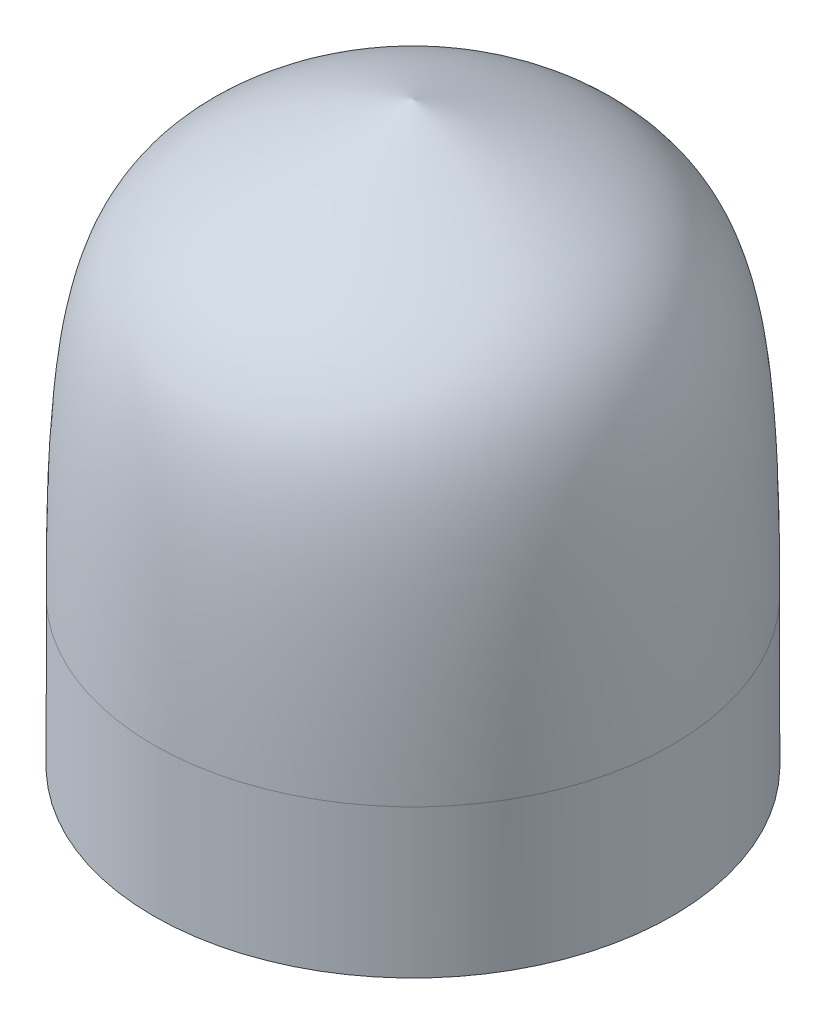
ISO-10303-21;
HEADER;
FILE_DESCRIPTION(('STEP AP214'),'2;1');
FILE_NAME('part.step','',(''),(''),'','','');
FILE_SCHEMA(('AUTOMOTIVE_DESIGN { 1 0 10303 214 1 1 1 1 }'));
ENDSEC;
DATA;
#1=APPLICATION_CONTEXT('core data for automotive mechanical design processes');
#2=APPLICATION_PROTOCOL_DEFINITION('international standard','automotive_design',2000,#1);
#3=PRODUCT_CONTEXT('',#1,'mechanical');
#4=PRODUCT('Part','Part','',(#3));
#5=PRODUCT_RELATED_PRODUCT_CATEGORY('part','',(#4));
#6=PRODUCT_DEFINITION_FORMATION('','',#4);
#7=PRODUCT_DEFINITION_CONTEXT('part definition',#1,'design');
#8=PRODUCT_DEFINITION('design','',#6,#7);
#9=PRODUCT_DEFINITION_SHAPE('','',#8);
#10=(LENGTH_UNIT() NAMED_UNIT(*) SI_UNIT(.MILLI.,.METRE.));
#11=(NAMED_UNIT(*) PLANE_ANGLE_UNIT() SI_UNIT($,.RADIAN.));
#12=(NAMED_UNIT(*) SI_UNIT($,.STERADIAN.) SOLID_ANGLE_UNIT());
#13=UNCERTAINTY_MEASURE_WITH_UNIT(LENGTH_MEASURE(1.E-05),#10,'distance_accuracy_value','');
#14=(GEOMETRIC_REPRESENTATION_CONTEXT(3) GLOBAL_UNCERTAINTY_ASSIGNED_CONTEXT((#13)) GLOBAL_UNIT_ASSIGNED_CONTEXT((#10,
#11,#12)) REPRESENTATION_CONTEXT('',''));
#15=CARTESIAN_POINT('',(0.,0.,0.));
#16=DIRECTION('',(0.,0.,1.));
#17=DIRECTION('',(1.,0.,0.));
#18=AXIS2_PLACEMENT_3D('',#15,#16,#17);
#19=CARTESIAN_POINT('',(0.,5.08,0.));
#20=DIRECTION('',(0.,-1.,0.));
#21=DIRECTION('',(0.,0.,-1.));
#22=AXIS2_PLACEMENT_3D('',#19,#20,#21);
#23=CYLINDRICAL_SURFACE('',#22,8.89);
#24=CARTESIAN_POINT('',(0.,5.08,0.));
#25=DIRECTION('',(0.,1.,0.));
#26=DIRECTION('',(0.,0.,1.));
#27=AXIS2_PLACEMENT_3D('',#24,#25,#26);
#28=CIRCLE('',#27,8.89);
#29=CARTESIAN_POINT('',(0.,5.08,8.89));
#30=VERTEX_POINT('',#29);
#31=EDGE_CURVE('E11',#30,#30,#28,.T.);
#32=ORIENTED_EDGE('',*,*,#31,.F.);
#33=EDGE_LOOP('',(#32));
#34=FACE_BOUND('',#33,.T.);
#35=CARTESIAN_POINT('',(0.,0.,0.));
#36=DIRECTION('',(0.,1.,0.));
#37=DIRECTION('',(0.,0.,1.));
#38=AXIS2_PLACEMENT_3D('',#35,#36,#37);
#39=CIRCLE('',#38,8.89);
#40=CARTESIAN_POINT('',(0.,0.,8.89));
#41=VERTEX_POINT('',#40);
#42=EDGE_CURVE('E40',#41,#41,#39,.T.);
#43=ORIENTED_EDGE('',*,*,#42,.T.);
#44=EDGE_LOOP('',(#43));
#45=FACE_BOUND('',#44,.T.);
#46=ADVANCED_FACE('F37',(#34,#45),#23,.T.);
#47=CARTESIAN_POINT('',(0.,0.,0.));
#48=DIRECTION('',(0.,1.,0.));
#49=DIRECTION('',(0.,0.,1.));
#50=AXIS2_PLACEMENT_3D('',#47,#48,#49);
#51=PLANE('',#50);
#52=ORIENTED_EDGE('',*,*,#42,.F.);
#53=EDGE_LOOP('',(#52));
#54=FACE_BOUND('',#53,.T.);
#55=ADVANCED_FACE('F48',(#54),#51,.F.);
#56=CARTESIAN_POINT('',(0.,19.7915900249237,0.));
#57=CARTESIAN_POINT('',(-8.89,16.8008368639246,0.));
#58=CARTESIAN_POINT('',(-8.89,5.08,0.));
#59=(BOUNDED_CURVE() B_SPLINE_CURVE(2,(#56,#57,#58),.UNSPECIFIED.,.F.,
.F.) B_SPLINE_CURVE_WITH_KNOTS((3,3),(0.,1.),
.UNSPECIFIED.) CURVE() GEOMETRIC_REPRESENTATION_ITEM() RATIONAL_B_SPLINE_CURVE((1.,
2.33333333333333,1.)) REPRESENTATION_ITEM(''));
#60=CARTESIAN_POINT('',(0.,5.08,0.));
#61=DIRECTION('',(0.,-1.,0.));
#62=AXIS1_PLACEMENT('',#60,#61);
#63=SURFACE_OF_REVOLUTION('',#59,#62);
#64=ORIENTED_EDGE('',*,*,#31,.T.);
#65=EDGE_LOOP('',(#64));
#66=FACE_BOUND('',#65,.T.);
#67=CARTESIAN_POINT('',(0.,19.7915900249237,0.));
#68=VERTEX_POINT('',#67);
#69=VERTEX_LOOP('',#68);
#70=FACE_BOUND('',#69,.T.);
#71=ADVANCED_FACE('F46',(#66,#70),#63,.T.);
#72=CLOSED_SHELL('',(#46,#55,#71));
#73=MANIFOLD_SOLID_BREP('B2',#72);
#74=ADVANCED_BREP_SHAPE_REPRESENTATION('',(#18,#73),#14);
#75=SHAPE_DEFINITION_REPRESENTATION(#9,#74);
ENDSEC;
END-ISO-10303-21;
